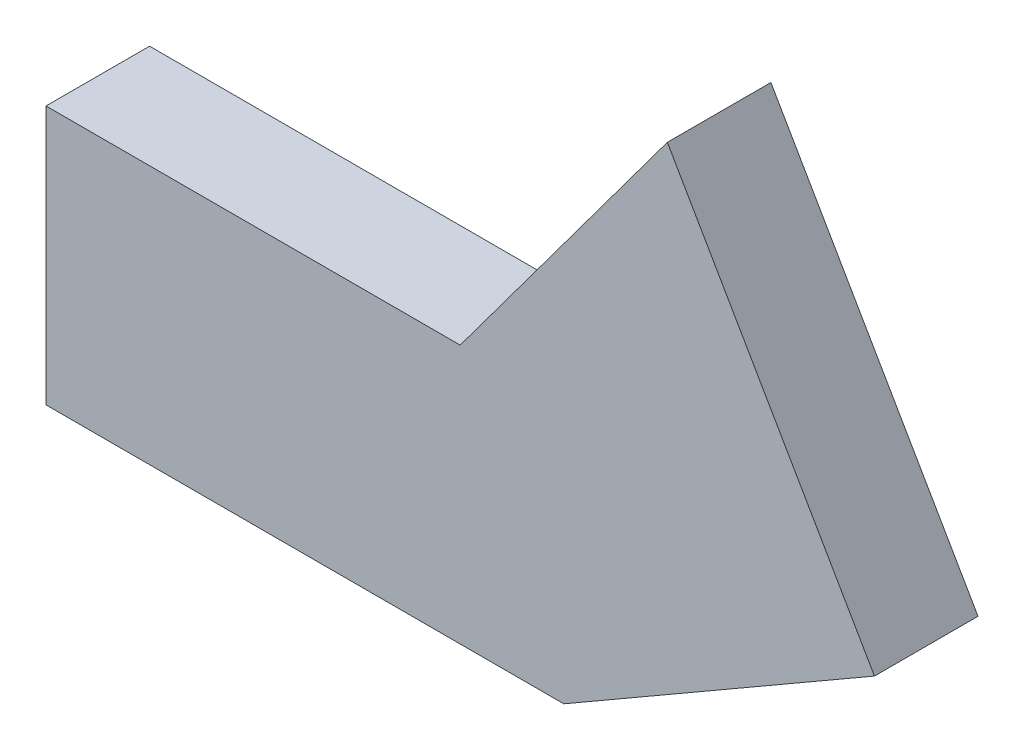
ISO-10303-21;
HEADER;
FILE_DESCRIPTION(('STEP AP214'),'2;1');
FILE_NAME('part.step','',(''),(''),'','','');
FILE_SCHEMA(('AUTOMOTIVE_DESIGN { 1 0 10303 214 1 1 1 1 }'));
ENDSEC;
DATA;
#1=APPLICATION_CONTEXT('core data for automotive mechanical design processes');
#2=APPLICATION_PROTOCOL_DEFINITION('international standard','automotive_design',2000,#1);
#3=PRODUCT_CONTEXT('',#1,'mechanical');
#4=PRODUCT('Part','Part','',(#3));
#5=PRODUCT_RELATED_PRODUCT_CATEGORY('part','',(#4));
#6=PRODUCT_DEFINITION_FORMATION('','',#4);
#7=PRODUCT_DEFINITION_CONTEXT('part definition',#1,'design');
#8=PRODUCT_DEFINITION('design','',#6,#7);
#9=PRODUCT_DEFINITION_SHAPE('','',#8);
#10=(LENGTH_UNIT() NAMED_UNIT(*) SI_UNIT(.MILLI.,.METRE.));
#11=(NAMED_UNIT(*) PLANE_ANGLE_UNIT() SI_UNIT($,.RADIAN.));
#12=(NAMED_UNIT(*) SI_UNIT($,.STERADIAN.) SOLID_ANGLE_UNIT());
#13=UNCERTAINTY_MEASURE_WITH_UNIT(LENGTH_MEASURE(1.E-05),#10,'distance_accuracy_value','');
#14=(GEOMETRIC_REPRESENTATION_CONTEXT(3) GLOBAL_UNCERTAINTY_ASSIGNED_CONTEXT((#13)) GLOBAL_UNIT_ASSIGNED_CONTEXT((#10,
#11,#12)) REPRESENTATION_CONTEXT('',''));
#15=CARTESIAN_POINT('',(0.,0.,0.));
#16=DIRECTION('',(0.,0.,1.));
#17=DIRECTION('',(1.,0.,0.));
#18=AXIS2_PLACEMENT_3D('',#15,#16,#17);
#19=CARTESIAN_POINT('',(80.,50.,20.));
#20=DIRECTION('',(-0.803150931464229,0.595775613203613,0.));
#21=DIRECTION('',(-0.595775613203614,-0.803150931464229,0.));
#22=AXIS2_PLACEMENT_3D('',#19,#20,#21);
#23=PLANE('',#22);
#24=DIRECTION('',(0.595775613203613,0.803150931464229,0.));
#25=VECTOR('',#24,1.);
#26=CARTESIAN_POINT('',(80.,50.,0.));
#27=LINE('',#26,#25);
#28=CARTESIAN_POINT('',(80.,50.,0.));
#29=VERTEX_POINT('',#28);
#30=CARTESIAN_POINT('',(120.,103.923048454133,0.));
#31=VERTEX_POINT('',#30);
#32=EDGE_CURVE('E119',#29,#31,#27,.T.);
#33=ORIENTED_EDGE('',*,*,#32,.F.);
#34=DIRECTION('',(0.,0.,-1.));
#35=VECTOR('',#34,1.);
#36=CARTESIAN_POINT('',(80.,50.,20.));
#37=LINE('',#36,#35);
#38=CARTESIAN_POINT('',(80.,50.,20.));
#39=VERTEX_POINT('',#38);
#40=EDGE_CURVE('E11',#39,#29,#37,.T.);
#41=ORIENTED_EDGE('',*,*,#40,.F.);
#42=DIRECTION('',(0.595775613203613,0.803150931464229,0.));
#43=VECTOR('',#42,1.);
#44=CARTESIAN_POINT('',(80.,50.,20.));
#45=LINE('',#44,#43);
#46=CARTESIAN_POINT('',(120.,103.923048454133,20.));
#47=VERTEX_POINT('',#46);
#48=EDGE_CURVE('E133',#39,#47,#45,.T.);
#49=ORIENTED_EDGE('',*,*,#48,.T.);
#50=DIRECTION('',(0.,0.,-1.));
#51=VECTOR('',#50,1.);
#52=CARTESIAN_POINT('',(120.,103.923048454133,20.));
#53=LINE('',#52,#51);
#54=EDGE_CURVE('E40',#47,#31,#53,.T.);
#55=ORIENTED_EDGE('',*,*,#54,.T.);
#56=EDGE_LOOP('',(#33,#41,#49,#55));
#57=FACE_BOUND('',#56,.T.);
#58=ADVANCED_FACE('F37',(#57),#23,.T.);
#59=CARTESIAN_POINT('',(0.,50.,20.));
#60=DIRECTION('',(0.,1.,0.));
#61=DIRECTION('',(0.,0.,1.));
#62=AXIS2_PLACEMENT_3D('',#59,#60,#61);
#63=PLANE('',#62);
#64=DIRECTION('',(1.,0.,0.));
#65=VECTOR('',#64,1.);
#66=CARTESIAN_POINT('',(0.,50.,0.));
#67=LINE('',#66,#65);
#68=CARTESIAN_POINT('',(0.,50.,0.));
#69=VERTEX_POINT('',#68);
#70=EDGE_CURVE('E131',#69,#29,#67,.T.);
#71=ORIENTED_EDGE('',*,*,#70,.F.);
#72=DIRECTION('',(0.,0.,-1.));
#73=VECTOR('',#72,1.);
#74=CARTESIAN_POINT('',(0.,50.,20.));
#75=LINE('',#74,#73);
#76=CARTESIAN_POINT('',(0.,50.,20.));
#77=VERTEX_POINT('',#76);
#78=EDGE_CURVE('E46',#77,#69,#75,.T.);
#79=ORIENTED_EDGE('',*,*,#78,.F.);
#80=DIRECTION('',(1.,0.,0.));
#81=VECTOR('',#80,1.);
#82=CARTESIAN_POINT('',(0.,50.,20.));
#83=LINE('',#82,#81);
#84=EDGE_CURVE('E114',#77,#39,#83,.T.);
#85=ORIENTED_EDGE('',*,*,#84,.T.);
#86=ORIENTED_EDGE('',*,*,#40,.T.);
#87=EDGE_LOOP('',(#71,#79,#85,#86));
#88=FACE_BOUND('',#87,.T.);
#89=ADVANCED_FACE('F142',(#88),#63,.T.);
#90=CARTESIAN_POINT('',(0.,0.,20.));
#91=DIRECTION('',(-1.,0.,0.));
#92=DIRECTION('',(0.,0.,1.));
#93=AXIS2_PLACEMENT_3D('',#90,#91,#92);
#94=PLANE('',#93);
#95=DIRECTION('',(0.,1.,0.));
#96=VECTOR('',#95,1.);
#97=CARTESIAN_POINT('',(0.,0.,0.));
#98=LINE('',#97,#96);
#99=CARTESIAN_POINT('',(0.,0.,0.));
#100=VERTEX_POINT('',#99);
#101=EDGE_CURVE('E100',#100,#69,#98,.T.);
#102=ORIENTED_EDGE('',*,*,#101,.F.);
#103=DIRECTION('',(0.,0.,-1.));
#104=VECTOR('',#103,1.);
#105=CARTESIAN_POINT('',(0.,0.,20.));
#106=LINE('',#105,#104);
#107=CARTESIAN_POINT('',(0.,0.,20.));
#108=VERTEX_POINT('',#107);
#109=EDGE_CURVE('E94',#108,#100,#106,.T.);
#110=ORIENTED_EDGE('',*,*,#109,.F.);
#111=DIRECTION('',(0.,1.,0.));
#112=VECTOR('',#111,1.);
#113=CARTESIAN_POINT('',(0.,0.,20.));
#114=LINE('',#113,#112);
#115=EDGE_CURVE('E98',#108,#77,#114,.T.);
#116=ORIENTED_EDGE('',*,*,#115,.T.);
#117=ORIENTED_EDGE('',*,*,#78,.T.);
#118=EDGE_LOOP('',(#102,#110,#116,#117));
#119=FACE_BOUND('',#118,.T.);
#120=ADVANCED_FACE('F96',(#119),#94,.T.);
#121=CARTESIAN_POINT('',(0.,0.,20.));
#122=DIRECTION('',(0.,1.,0.));
#123=DIRECTION('',(0.,0.,1.));
#124=AXIS2_PLACEMENT_3D('',#121,#122,#123);
#125=PLANE('',#124);
#126=DIRECTION('',(1.,0.,0.));
#127=VECTOR('',#126,1.);
#128=CARTESIAN_POINT('',(0.,0.,0.));
#129=LINE('',#128,#127);
#130=CARTESIAN_POINT('',(100.,0.,0.));
#131=VERTEX_POINT('',#130);
#132=EDGE_CURVE('E128',#100,#131,#129,.T.);
#133=ORIENTED_EDGE('',*,*,#132,.T.);
#134=DIRECTION('',(0.,0.,-1.));
#135=VECTOR('',#134,1.);
#136=CARTESIAN_POINT('',(100.,0.,20.));
#137=LINE('',#136,#135);
#138=CARTESIAN_POINT('',(100.,0.,20.));
#139=VERTEX_POINT('',#138);
#140=EDGE_CURVE('E103',#139,#131,#137,.T.);
#141=ORIENTED_EDGE('',*,*,#140,.F.);
#142=DIRECTION('',(1.,0.,0.));
#143=VECTOR('',#142,1.);
#144=CARTESIAN_POINT('',(0.,0.,20.));
#145=LINE('',#144,#143);
#146=EDGE_CURVE('E106',#108,#139,#145,.T.);
#147=ORIENTED_EDGE('',*,*,#146,.F.);
#148=ORIENTED_EDGE('',*,*,#109,.T.);
#149=EDGE_LOOP('',(#133,#141,#147,#148));
#150=FACE_BOUND('',#149,.T.);
#151=ADVANCED_FACE('F107',(#150),#125,.F.);
#152=CARTESIAN_POINT('',(100.,0.,20.));
#153=DIRECTION('',(-0.500000000000001,0.866025403784438,0.));
#154=DIRECTION('',(-0.866025403784438,-0.500000000000001,0.));
#155=AXIS2_PLACEMENT_3D('',#152,#153,#154);
#156=PLANE('',#155);
#157=DIRECTION('',(0.866025403784438,0.500000000000001,0.));
#158=VECTOR('',#157,1.);
#159=CARTESIAN_POINT('',(100.,0.,0.));
#160=LINE('',#159,#158);
#161=CARTESIAN_POINT('',(160.,34.6410161513777,0.));
#162=VERTEX_POINT('',#161);
#163=EDGE_CURVE('E125',#131,#162,#160,.T.);
#164=ORIENTED_EDGE('',*,*,#163,.T.);
#165=DIRECTION('',(0.,0.,-1.));
#166=VECTOR('',#165,1.);
#167=CARTESIAN_POINT('',(160.,34.6410161513777,20.));
#168=LINE('',#167,#166);
#169=CARTESIAN_POINT('',(160.,34.6410161513777,20.));
#170=VERTEX_POINT('',#169);
#171=EDGE_CURVE('E136',#170,#162,#168,.T.);
#172=ORIENTED_EDGE('',*,*,#171,.F.);
#173=DIRECTION('',(0.866025403784438,0.500000000000001,0.));
#174=VECTOR('',#173,1.);
#175=CARTESIAN_POINT('',(100.,0.,20.));
#176=LINE('',#175,#174);
#177=EDGE_CURVE('E111',#139,#170,#176,.T.);
#178=ORIENTED_EDGE('',*,*,#177,.F.);
#179=ORIENTED_EDGE('',*,*,#140,.T.);
#180=EDGE_LOOP('',(#164,#172,#178,#179));
#181=FACE_BOUND('',#180,.T.);
#182=ADVANCED_FACE('F155',(#181),#156,.F.);
#183=CARTESIAN_POINT('',(120.,103.923048454133,20.));
#184=DIRECTION('',(0.866025403784438,0.500000000000001,0.));
#185=DIRECTION('',(-0.500000000000001,0.866025403784438,0.));
#186=AXIS2_PLACEMENT_3D('',#183,#184,#185);
#187=PLANE('',#186);
#188=DIRECTION('',(0.500000000000001,-0.866025403784438,0.));
#189=VECTOR('',#188,1.);
#190=CARTESIAN_POINT('',(120.,103.923048454133,0.));
#191=LINE('',#190,#189);
#192=EDGE_CURVE('E122',#31,#162,#191,.T.);
#193=ORIENTED_EDGE('',*,*,#192,.F.);
#194=ORIENTED_EDGE('',*,*,#54,.F.);
#195=DIRECTION('',(0.500000000000001,-0.866025403784438,0.));
#196=VECTOR('',#195,1.);
#197=CARTESIAN_POINT('',(120.,103.923048454133,20.));
#198=LINE('',#197,#196);
#199=EDGE_CURVE('E223',#47,#170,#198,.T.);
#200=ORIENTED_EDGE('',*,*,#199,.T.);
#201=ORIENTED_EDGE('',*,*,#171,.T.);
#202=EDGE_LOOP('',(#193,#194,#200,#201));
#203=FACE_BOUND('',#202,.T.);
#204=ADVANCED_FACE('F138',(#203),#187,.T.);
#205=CARTESIAN_POINT('',(0.,0.,20.));
#206=DIRECTION('',(0.,0.,-1.));
#207=DIRECTION('',(-1.,0.,0.));
#208=AXIS2_PLACEMENT_3D('',#205,#206,#207);
#209=PLANE('',#208);
#210=ORIENTED_EDGE('',*,*,#48,.F.);
#211=ORIENTED_EDGE('',*,*,#84,.F.);
#212=ORIENTED_EDGE('',*,*,#115,.F.);
#213=ORIENTED_EDGE('',*,*,#146,.T.);
#214=ORIENTED_EDGE('',*,*,#177,.T.);
#215=ORIENTED_EDGE('',*,*,#199,.F.);
#216=EDGE_LOOP('',(#210,#211,#212,#213,#214,#215));
#217=FACE_BOUND('',#216,.T.);
#218=ADVANCED_FACE('F113',(#217),#209,.F.);
#219=CARTESIAN_POINT('',(0.,0.,0.));
#220=DIRECTION('',(0.,0.,-1.));
#221=DIRECTION('',(-1.,0.,0.));
#222=AXIS2_PLACEMENT_3D('',#219,#220,#221);
#223=PLANE('',#222);
#224=ORIENTED_EDGE('',*,*,#32,.T.);
#225=ORIENTED_EDGE('',*,*,#192,.T.);
#226=ORIENTED_EDGE('',*,*,#163,.F.);
#227=ORIENTED_EDGE('',*,*,#132,.F.);
#228=ORIENTED_EDGE('',*,*,#101,.T.);
#229=ORIENTED_EDGE('',*,*,#70,.T.);
#230=EDGE_LOOP('',(#224,#225,#226,#227,#228,#229));
#231=FACE_BOUND('',#230,.T.);
#232=ADVANCED_FACE('F141',(#231),#223,.T.);
#233=CLOSED_SHELL('',(#58,#89,#120,#151,#182,#204,#218,#232));
#234=MANIFOLD_SOLID_BREP('B2',#233);
#235=ADVANCED_BREP_SHAPE_REPRESENTATION('',(#18,#234),#14);
#236=SHAPE_DEFINITION_REPRESENTATION(#9,#235);
ENDSEC;
END-ISO-10303-21;
